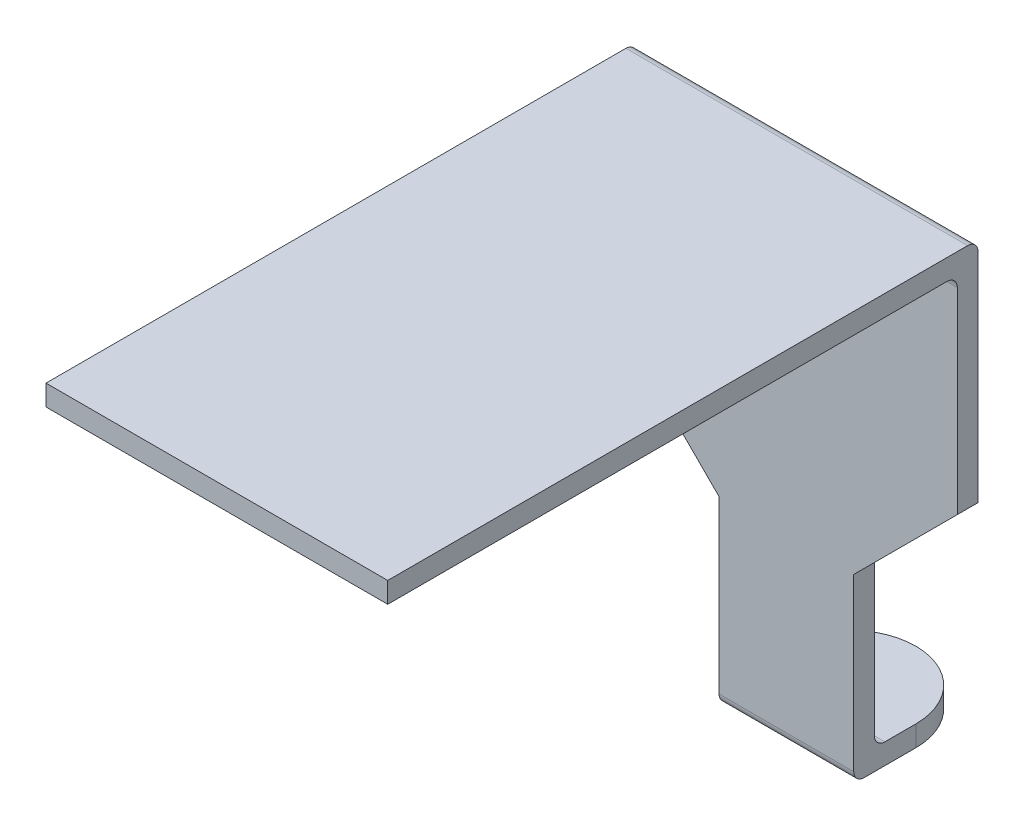
ISO-10303-21;
HEADER;
FILE_DESCRIPTION(('STEP AP214'),'2;1');
FILE_NAME('part.step','',(''),(''),'','','');
FILE_SCHEMA(('AUTOMOTIVE_DESIGN { 1 0 10303 214 1 1 1 1 }'));
ENDSEC;
DATA;
#1=APPLICATION_CONTEXT('core data for automotive mechanical design processes');
#2=APPLICATION_PROTOCOL_DEFINITION('international standard','automotive_design',2000,#1);
#3=PRODUCT_CONTEXT('',#1,'mechanical');
#4=PRODUCT('Part','Part','',(#3));
#5=PRODUCT_RELATED_PRODUCT_CATEGORY('part','',(#4));
#6=PRODUCT_DEFINITION_FORMATION('','',#4);
#7=PRODUCT_DEFINITION_CONTEXT('part definition',#1,'design');
#8=PRODUCT_DEFINITION('design','',#6,#7);
#9=PRODUCT_DEFINITION_SHAPE('','',#8);
#10=(LENGTH_UNIT() NAMED_UNIT(*) SI_UNIT(.MILLI.,.METRE.));
#11=(NAMED_UNIT(*) PLANE_ANGLE_UNIT() SI_UNIT($,.RADIAN.));
#12=(NAMED_UNIT(*) SI_UNIT($,.STERADIAN.) SOLID_ANGLE_UNIT());
#13=UNCERTAINTY_MEASURE_WITH_UNIT(LENGTH_MEASURE(1.E-05),#10,'distance_accuracy_value','');
#14=(GEOMETRIC_REPRESENTATION_CONTEXT(3) GLOBAL_UNCERTAINTY_ASSIGNED_CONTEXT((#13)) GLOBAL_UNIT_ASSIGNED_CONTEXT((#10,
#11,#12)) REPRESENTATION_CONTEXT('',''));
#15=CARTESIAN_POINT('',(0.,0.,0.));
#16=DIRECTION('',(0.,0.,1.));
#17=DIRECTION('',(1.,0.,0.));
#18=AXIS2_PLACEMENT_3D('',#15,#16,#17);
#19=CARTESIAN_POINT('',(5.1,-6.6,-15.));
#20=DIRECTION('',(0.,-1.,0.));
#21=DIRECTION('',(0.,0.,-1.));
#22=AXIS2_PLACEMENT_3D('',#19,#20,#21);
#23=PLANE('',#22);
#24=DIRECTION('',(0.,0.,-1.));
#25=VECTOR('',#24,1.);
#26=CARTESIAN_POINT('',(-0.65,-6.6,-15.));
#27=LINE('',#26,#25);
#28=CARTESIAN_POINT('',(-0.65,-6.6,-13.9));
#29=VERTEX_POINT('',#28);
#30=CARTESIAN_POINT('',(-0.650000000000001,-6.6,-14.4));
#31=VERTEX_POINT('',#30);
#32=EDGE_CURVE('E120',#29,#31,#27,.T.);
#33=ORIENTED_EDGE('',*,*,#32,.T.);
#34=CARTESIAN_POINT('',(0.,-6.6,-14.4));
#35=DIRECTION('',(0.,-1.,0.));
#36=DIRECTION('',(0.,0.,-1.));
#37=AXIS2_PLACEMENT_3D('',#34,#35,#36);
#38=CIRCLE('',#37,0.65);
#39=CARTESIAN_POINT('',(0.649999999999997,-6.6,-14.4));
#40=VERTEX_POINT('',#39);
#41=EDGE_CURVE('E110',#40,#31,#38,.F.);
#42=ORIENTED_EDGE('',*,*,#41,.F.);
#43=DIRECTION('',(0.,0.,-1.));
#44=VECTOR('',#43,1.);
#45=CARTESIAN_POINT('',(0.65,-6.6,-15.));
#46=LINE('',#45,#44);
#47=CARTESIAN_POINT('',(0.65,-6.6,-13.9));
#48=VERTEX_POINT('',#47);
#49=EDGE_CURVE('E125',#40,#48,#46,.F.);
#50=ORIENTED_EDGE('',*,*,#49,.T.);
#51=DIRECTION('',(-1.,0.,0.));
#52=VECTOR('',#51,1.);
#53=CARTESIAN_POINT('',(5.1,-6.6,-13.9));
#54=LINE('',#53,#52);
#55=EDGE_CURVE('E118',#29,#48,#54,.F.);
#56=ORIENTED_EDGE('',*,*,#55,.F.);
#57=EDGE_LOOP('',(#33,#42,#50,#56));
#58=FACE_BOUND('',#57,.T.);
#59=ADVANCED_FACE('F17',(#58),#23,.T.);
#60=CARTESIAN_POINT('',(-0.65,-6.4,-15.05));
#61=DIRECTION('',(0.,-1.,0.));
#62=DIRECTION('',(0.,0.,-1.));
#63=AXIS2_PLACEMENT_3D('',#60,#61,#62);
#64=PLANE('',#63);
#65=DIRECTION('',(1.,0.,0.));
#66=VECTOR('',#65,1.);
#67=CARTESIAN_POINT('',(-0.65,-6.4,-14.1));
#68=LINE('',#67,#66);
#69=CARTESIAN_POINT('',(-0.65,-6.4,-14.1));
#70=VERTEX_POINT('',#69);
#71=CARTESIAN_POINT('',(0.65,-6.4,-14.1));
#72=VERTEX_POINT('',#71);
#73=EDGE_CURVE('E158',#70,#72,#68,.T.);
#74=ORIENTED_EDGE('',*,*,#73,.T.);
#75=DIRECTION('',(0.,0.,-1.));
#76=VECTOR('',#75,1.);
#77=CARTESIAN_POINT('',(0.65,-6.4,-15.05));
#78=LINE('',#77,#76);
#79=CARTESIAN_POINT('',(0.649999999999997,-6.4,-14.4));
#80=VERTEX_POINT('',#79);
#81=EDGE_CURVE('E124',#80,#72,#78,.F.);
#82=ORIENTED_EDGE('',*,*,#81,.F.);
#83=CARTESIAN_POINT('',(0.,-6.4,-14.4));
#84=DIRECTION('',(0.,-1.,0.));
#85=DIRECTION('',(0.,0.,-1.));
#86=AXIS2_PLACEMENT_3D('',#83,#84,#85);
#87=CIRCLE('',#86,0.65);
#88=CARTESIAN_POINT('',(-0.650000000000001,-6.4,-14.4));
#89=VERTEX_POINT('',#88);
#90=EDGE_CURVE('E20',#89,#80,#87,.T.);
#91=ORIENTED_EDGE('',*,*,#90,.F.);
#92=DIRECTION('',(0.,0.,-1.));
#93=VECTOR('',#92,1.);
#94=CARTESIAN_POINT('',(-0.65,-6.4,-14.));
#95=LINE('',#94,#93);
#96=EDGE_CURVE('E129',#89,#70,#95,.F.);
#97=ORIENTED_EDGE('',*,*,#96,.T.);
#98=EDGE_LOOP('',(#74,#82,#91,#97));
#99=FACE_BOUND('',#98,.T.);
#100=ADVANCED_FACE('F175',(#99),#64,.F.);
#101=CARTESIAN_POINT('',(0.,-6.4,-14.4));
#102=DIRECTION('',(0.,-1.,0.));
#103=DIRECTION('',(0.,0.,-1.));
#104=AXIS2_PLACEMENT_3D('',#101,#102,#103);
#105=CYLINDRICAL_SURFACE('',#104,0.65);
#106=DIRECTION('',(0.,1.,0.));
#107=VECTOR('',#106,1.);
#108=CARTESIAN_POINT('',(0.649999999999994,-7.915294643796,-14.4));
#109=LINE('',#108,#107);
#110=EDGE_CURVE('E116',#80,#40,#109,.F.);
#111=ORIENTED_EDGE('',*,*,#110,.T.);
#112=ORIENTED_EDGE('',*,*,#41,.T.);
#113=DIRECTION('',(0.,1.,0.));
#114=VECTOR('',#113,1.);
#115=CARTESIAN_POINT('',(-0.650000000000001,-7.915294643796,-14.4));
#116=LINE('',#115,#114);
#117=EDGE_CURVE('E114',#31,#89,#116,.T.);
#118=ORIENTED_EDGE('',*,*,#117,.T.);
#119=ORIENTED_EDGE('',*,*,#90,.T.);
#120=EDGE_LOOP('',(#111,#112,#118,#119));
#121=FACE_BOUND('',#120,.T.);
#122=ADVANCED_FACE('F112',(#121),#105,.T.);
#123=CARTESIAN_POINT('',(5.1,-6.5,-13.9));
#124=DIRECTION('',(-1.,0.,0.));
#125=DIRECTION('',(0.,0.,1.));
#126=AXIS2_PLACEMENT_3D('',#123,#124,#125);
#127=CYLINDRICAL_SURFACE('',#126,0.1);
#128=CARTESIAN_POINT('',(-0.65,-6.5,-13.9));
#129=DIRECTION('',(-1.,0.,0.));
#130=DIRECTION('',(0.,0.,1.));
#131=AXIS2_PLACEMENT_3D('',#128,#129,#130);
#132=CIRCLE('',#131,0.1);
#133=CARTESIAN_POINT('',(-0.65,-6.5,-13.8));
#134=VERTEX_POINT('',#133);
#135=EDGE_CURVE('E159',#134,#29,#132,.F.);
#136=ORIENTED_EDGE('',*,*,#135,.T.);
#137=ORIENTED_EDGE('',*,*,#55,.T.);
#138=CARTESIAN_POINT('',(0.65,-6.5,-13.9));
#139=DIRECTION('',(-1.,0.,0.));
#140=DIRECTION('',(0.,0.,1.));
#141=AXIS2_PLACEMENT_3D('',#138,#139,#140);
#142=CIRCLE('',#141,0.1);
#143=CARTESIAN_POINT('',(0.65,-6.5,-13.8));
#144=VERTEX_POINT('',#143);
#145=EDGE_CURVE('E142',#48,#144,#142,.T.);
#146=ORIENTED_EDGE('',*,*,#145,.T.);
#147=DIRECTION('',(-1.,0.,0.));
#148=VECTOR('',#147,1.);
#149=CARTESIAN_POINT('',(1.65,-6.5,-13.8));
#150=LINE('',#149,#148);
#151=EDGE_CURVE('E229',#144,#134,#150,.T.);
#152=ORIENTED_EDGE('',*,*,#151,.T.);
#153=EDGE_LOOP('',(#136,#137,#146,#152));
#154=FACE_BOUND('',#153,.T.);
#155=ADVANCED_FACE('F467',(#154),#127,.T.);
#156=CARTESIAN_POINT('',(1.65,-1.95,-13.7));
#157=DIRECTION('',(-1.,0.,0.));
#158=DIRECTION('',(0.,0.,1.));
#159=AXIS2_PLACEMENT_3D('',#156,#157,#158);
#160=CYLINDRICAL_SURFACE('',#159,0.1);
#161=DIRECTION('',(1.,0.,0.));
#162=VECTOR('',#161,1.);
#163=CARTESIAN_POINT('',(-1.65,-1.85,-13.7));
#164=LINE('',#163,#162);
#165=CARTESIAN_POINT('',(1.65,-1.85,-13.7));
#166=VERTEX_POINT('',#165);
#167=CARTESIAN_POINT('',(-1.65,-1.85,-13.7));
#168=VERTEX_POINT('',#167);
#169=EDGE_CURVE('E256',#166,#168,#164,.F.);
#170=ORIENTED_EDGE('',*,*,#169,.T.);
#171=CARTESIAN_POINT('',(-1.65,-1.95,-13.7));
#172=DIRECTION('',(-1.,0.,0.));
#173=DIRECTION('',(0.,0.,1.));
#174=AXIS2_PLACEMENT_3D('',#171,#172,#173);
#175=CIRCLE('',#174,0.1);
#176=CARTESIAN_POINT('',(-1.65,-1.95,-13.8));
#177=VERTEX_POINT('',#176);
#178=EDGE_CURVE('E163',#177,#168,#175,.F.);
#179=ORIENTED_EDGE('',*,*,#178,.F.);
#180=DIRECTION('',(-1.,0.,0.));
#181=VECTOR('',#180,1.);
#182=CARTESIAN_POINT('',(1.65,-1.95,-13.8));
#183=LINE('',#182,#181);
#184=CARTESIAN_POINT('',(1.64999999999999,-1.95,-13.8));
#185=VERTEX_POINT('',#184);
#186=EDGE_CURVE('E242',#177,#185,#183,.F.);
#187=ORIENTED_EDGE('',*,*,#186,.T.);
#188=CARTESIAN_POINT('',(1.65,-1.95,-13.7));
#189=DIRECTION('',(-1.,0.,0.));
#190=DIRECTION('',(0.,0.,1.));
#191=AXIS2_PLACEMENT_3D('',#188,#189,#190);
#192=CIRCLE('',#191,0.1);
#193=EDGE_CURVE('E161',#166,#185,#192,.T.);
#194=ORIENTED_EDGE('',*,*,#193,.F.);
#195=EDGE_LOOP('',(#170,#179,#187,#194));
#196=FACE_BOUND('',#195,.T.);
#197=ADVANCED_FACE('F349',(#196),#160,.F.);
#198=CARTESIAN_POINT('',(0.65,-4.85,-14.));
#199=DIRECTION('',(0.707106781186048,-0.707106781187048,0.));
#200=DIRECTION('',(0.707106781187048,0.707106781186048,0.));
#201=AXIS2_PLACEMENT_3D('',#198,#199,#200);
#202=PLANE('',#201);
#203=DIRECTION('',(-0.707106781186901,-0.707106781186194,0.));
#204=VECTOR('',#203,1.);
#205=CARTESIAN_POINT('',(1.65,-3.850000000001,-13.8));
#206=LINE('',#205,#204);
#207=CARTESIAN_POINT('',(1.64999999999989,-3.85000000000113,-13.8));
#208=VERTEX_POINT('',#207);
#209=CARTESIAN_POINT('',(0.65,-4.85,-13.8));
#210=VERTEX_POINT('',#209);
#211=EDGE_CURVE('E152',#208,#210,#206,.T.);
#212=ORIENTED_EDGE('',*,*,#211,.T.);
#213=DIRECTION('',(0.,0.,1.));
#214=VECTOR('',#213,1.);
#215=CARTESIAN_POINT('',(0.65,-4.85,-13.8));
#216=LINE('',#215,#214);
#217=CARTESIAN_POINT('',(0.65,-4.85,-14.));
#218=VERTEX_POINT('',#217);
#219=EDGE_CURVE('E155',#210,#218,#216,.F.);
#220=ORIENTED_EDGE('',*,*,#219,.T.);
#221=DIRECTION('',(0.707106781186901,0.707106781186194,0.));
#222=VECTOR('',#221,1.);
#223=CARTESIAN_POINT('',(0.65,-4.85,-14.));
#224=LINE('',#223,#222);
#225=CARTESIAN_POINT('',(1.64999999999989,-3.85000000000113,-14.));
#226=VERTEX_POINT('',#225);
#227=EDGE_CURVE('E195',#218,#226,#224,.T.);
#228=ORIENTED_EDGE('',*,*,#227,.T.);
#229=DIRECTION('',(0.,0.,1.));
#230=VECTOR('',#229,1.);
#231=CARTESIAN_POINT('',(1.65000000000021,-3.85000000000121,-14.));
#232=LINE('',#231,#230);
#233=EDGE_CURVE('E135',#226,#208,#232,.T.);
#234=ORIENTED_EDGE('',*,*,#233,.T.);
#235=EDGE_LOOP('',(#212,#220,#228,#234));
#236=FACE_BOUND('',#235,.T.);
#237=ADVANCED_FACE('F344',(#236),#202,.T.);
#238=CARTESIAN_POINT('',(-0.65,-4.85,-14.));
#239=DIRECTION('',(-0.707106781186548,-0.707106781186548,0.));
#240=DIRECTION('',(0.707106781186548,-0.707106781186548,0.));
#241=AXIS2_PLACEMENT_3D('',#238,#239,#240);
#242=PLANE('',#241);
#243=DIRECTION('',(0.707106781186548,-0.707106781186548,0.));
#244=VECTOR('',#243,1.);
#245=CARTESIAN_POINT('',(-1.65,-3.85,-14.));
#246=LINE('',#245,#244);
#247=CARTESIAN_POINT('',(-1.65,-3.85,-14.));
#248=VERTEX_POINT('',#247);
#249=CARTESIAN_POINT('',(-0.65,-4.85,-14.));
#250=VERTEX_POINT('',#249);
#251=EDGE_CURVE('E212',#248,#250,#246,.T.);
#252=ORIENTED_EDGE('',*,*,#251,.T.);
#253=DIRECTION('',(0.,0.,-1.));
#254=VECTOR('',#253,1.);
#255=CARTESIAN_POINT('',(-0.65,-4.85,-14.));
#256=LINE('',#255,#254);
#257=CARTESIAN_POINT('',(-0.65,-4.85,-13.8));
#258=VERTEX_POINT('',#257);
#259=EDGE_CURVE('E132',#250,#258,#256,.F.);
#260=ORIENTED_EDGE('',*,*,#259,.T.);
#261=DIRECTION('',(-0.707106781186548,0.707106781186548,0.));
#262=VECTOR('',#261,1.);
#263=CARTESIAN_POINT('',(-0.65,-4.85,-13.8));
#264=LINE('',#263,#262);
#265=CARTESIAN_POINT('',(-1.65,-3.85,-13.8));
#266=VERTEX_POINT('',#265);
#267=EDGE_CURVE('E228',#258,#266,#264,.T.);
#268=ORIENTED_EDGE('',*,*,#267,.T.);
#269=DIRECTION('',(0.,0.,1.));
#270=VECTOR('',#269,1.);
#271=CARTESIAN_POINT('',(-1.65,-3.85,-14.));
#272=LINE('',#271,#270);
#273=EDGE_CURVE('E130',#266,#248,#272,.F.);
#274=ORIENTED_EDGE('',*,*,#273,.T.);
#275=EDGE_LOOP('',(#252,#260,#268,#274));
#276=FACE_BOUND('',#275,.T.);
#277=ADVANCED_FACE('F445',(#276),#242,.T.);
#278=CARTESIAN_POINT('',(-0.65,-7.915294643796,-14.));
#279=DIRECTION('',(1.,0.,0.));
#280=DIRECTION('',(0.,0.,-1.));
#281=AXIS2_PLACEMENT_3D('',#278,#279,#280);
#282=PLANE('',#281);
#283=ORIENTED_EDGE('',*,*,#135,.F.);
#284=DIRECTION('',(0.,1.,0.));
#285=VECTOR('',#284,1.);
#286=CARTESIAN_POINT('',(-0.65,-4.85,-13.8));
#287=LINE('',#286,#285);
#288=EDGE_CURVE('E225',#134,#258,#287,.T.);
#289=ORIENTED_EDGE('',*,*,#288,.T.);
#290=ORIENTED_EDGE('',*,*,#259,.F.);
#291=DIRECTION('',(0.,1.,0.));
#292=VECTOR('',#291,1.);
#293=CARTESIAN_POINT('',(-0.65,-1.65,-14.));
#294=LINE('',#293,#292);
#295=CARTESIAN_POINT('',(-0.65,-6.3,-14.));
#296=VERTEX_POINT('',#295);
#297=EDGE_CURVE('E202',#250,#296,#294,.F.);
#298=ORIENTED_EDGE('',*,*,#297,.T.);
#299=CARTESIAN_POINT('',(-0.65,-6.3,-14.1));
#300=DIRECTION('',(1.,0.,0.));
#301=DIRECTION('',(0.,0.,-1.));
#302=AXIS2_PLACEMENT_3D('',#299,#300,#301);
#303=CIRCLE('',#302,0.1);
#304=EDGE_CURVE('E156',#296,#70,#303,.T.);
#305=ORIENTED_EDGE('',*,*,#304,.T.);
#306=ORIENTED_EDGE('',*,*,#96,.F.);
#307=ORIENTED_EDGE('',*,*,#117,.F.);
#308=ORIENTED_EDGE('',*,*,#32,.F.);
#309=EDGE_LOOP('',(#283,#289,#290,#298,#305,#306,#307,#308));
#310=FACE_BOUND('',#309,.T.);
#311=ADVANCED_FACE('F127',(#310),#282,.F.);
#312=CARTESIAN_POINT('',(-0.65,-6.3,-14.1));
#313=DIRECTION('',(1.,0.,0.));
#314=DIRECTION('',(0.,0.,-1.));
#315=AXIS2_PLACEMENT_3D('',#312,#313,#314);
#316=CYLINDRICAL_SURFACE('',#315,0.1);
#317=DIRECTION('',(1.,0.,0.));
#318=VECTOR('',#317,1.);
#319=CARTESIAN_POINT('',(-1.65,-6.3,-14.));
#320=LINE('',#319,#318);
#321=CARTESIAN_POINT('',(0.65,-6.3,-14.));
#322=VERTEX_POINT('',#321);
#323=EDGE_CURVE('E180',#296,#322,#320,.T.);
#324=ORIENTED_EDGE('',*,*,#323,.T.);
#325=CARTESIAN_POINT('',(0.65,-6.3,-14.1));
#326=DIRECTION('',(1.,0.,0.));
#327=DIRECTION('',(0.,0.,-1.));
#328=AXIS2_PLACEMENT_3D('',#325,#326,#327);
#329=CIRCLE('',#328,0.1);
#330=EDGE_CURVE('E143',#322,#72,#329,.T.);
#331=ORIENTED_EDGE('',*,*,#330,.T.);
#332=ORIENTED_EDGE('',*,*,#73,.F.);
#333=ORIENTED_EDGE('',*,*,#304,.F.);
#334=EDGE_LOOP('',(#324,#331,#332,#333));
#335=FACE_BOUND('',#334,.T.);
#336=ADVANCED_FACE('F178',(#335),#316,.F.);
#337=CARTESIAN_POINT('',(0.65,-7.915294643796,-13.8));
#338=DIRECTION('',(-1.,0.,0.));
#339=DIRECTION('',(0.,0.,1.));
#340=AXIS2_PLACEMENT_3D('',#337,#338,#339);
#341=PLANE('',#340);
#342=ORIENTED_EDGE('',*,*,#145,.F.);
#343=ORIENTED_EDGE('',*,*,#49,.F.);
#344=ORIENTED_EDGE('',*,*,#110,.F.);
#345=ORIENTED_EDGE('',*,*,#81,.T.);
#346=ORIENTED_EDGE('',*,*,#330,.F.);
#347=DIRECTION('',(0.,1.,0.));
#348=VECTOR('',#347,1.);
#349=CARTESIAN_POINT('',(0.65,-1.65,-14.));
#350=LINE('',#349,#348);
#351=EDGE_CURVE('E187',#322,#218,#350,.T.);
#352=ORIENTED_EDGE('',*,*,#351,.T.);
#353=ORIENTED_EDGE('',*,*,#219,.F.);
#354=DIRECTION('',(0.,1.,0.));
#355=VECTOR('',#354,1.);
#356=CARTESIAN_POINT('',(0.65,-4.85,-13.8));
#357=LINE('',#356,#355);
#358=EDGE_CURVE('E233',#210,#144,#357,.F.);
#359=ORIENTED_EDGE('',*,*,#358,.T.);
#360=EDGE_LOOP('',(#342,#343,#344,#345,#346,#352,#353,#359));
#361=FACE_BOUND('',#360,.T.);
#362=ADVANCED_FACE('F184',(#361),#341,.F.);
#363=CARTESIAN_POINT('',(1.65,-4.85,-13.8));
#364=DIRECTION('',(0.,0.,-1.));
#365=DIRECTION('',(-1.,0.,0.));
#366=AXIS2_PLACEMENT_3D('',#363,#364,#365);
#367=PLANE('',#366);
#368=ORIENTED_EDGE('',*,*,#186,.F.);
#369=DIRECTION('',(0.,1.,0.));
#370=VECTOR('',#369,1.);
#371=CARTESIAN_POINT('',(-1.65,-1.65,-13.8));
#372=LINE('',#371,#370);
#373=EDGE_CURVE('E279',#177,#266,#372,.F.);
#374=ORIENTED_EDGE('',*,*,#373,.T.);
#375=ORIENTED_EDGE('',*,*,#267,.F.);
#376=ORIENTED_EDGE('',*,*,#288,.F.);
#377=ORIENTED_EDGE('',*,*,#151,.F.);
#378=ORIENTED_EDGE('',*,*,#358,.F.);
#379=ORIENTED_EDGE('',*,*,#211,.F.);
#380=DIRECTION('',(-1.767249541151E-13,-1.,0.));
#381=VECTOR('',#380,1.);
#382=CARTESIAN_POINT('',(1.65,-1.85,-13.8));
#383=LINE('',#382,#381);
#384=EDGE_CURVE('E268',#208,#185,#383,.F.);
#385=ORIENTED_EDGE('',*,*,#384,.T.);
#386=EDGE_LOOP('',(#368,#374,#375,#376,#377,#378,#379,#385));
#387=FACE_BOUND('',#386,.T.);
#388=ADVANCED_FACE('F346',(#387),#367,.F.);
#389=CARTESIAN_POINT('',(-1.65,-1.85,-14.));
#390=DIRECTION('',(0.,1.,0.));
#391=DIRECTION('',(0.,0.,1.));
#392=AXIS2_PLACEMENT_3D('',#389,#390,#391);
#393=PLANE('',#392);
#394=ORIENTED_EDGE('',*,*,#169,.F.);
#395=DIRECTION('',(0.,0.,1.));
#396=VECTOR('',#395,1.);
#397=CARTESIAN_POINT('',(1.65,-1.85,-14.));
#398=LINE('',#397,#396);
#399=CARTESIAN_POINT('',(1.65,-1.85,-8.3));
#400=VERTEX_POINT('',#399);
#401=EDGE_CURVE('E300',#166,#400,#398,.T.);
#402=ORIENTED_EDGE('',*,*,#401,.T.);
#403=DIRECTION('',(1.,0.,0.));
#404=VECTOR('',#403,1.);
#405=CARTESIAN_POINT('',(-1.65,-1.85,-8.3));
#406=LINE('',#405,#404);
#407=CARTESIAN_POINT('',(-1.65,-1.85,-8.3));
#408=VERTEX_POINT('',#407);
#409=EDGE_CURVE('E197',#408,#400,#406,.T.);
#410=ORIENTED_EDGE('',*,*,#409,.F.);
#411=DIRECTION('',(0.,0.,-1.));
#412=VECTOR('',#411,1.);
#413=CARTESIAN_POINT('',(-1.65,-1.85,-14.));
#414=LINE('',#413,#412);
#415=EDGE_CURVE('E275',#408,#168,#414,.T.);
#416=ORIENTED_EDGE('',*,*,#415,.T.);
#417=EDGE_LOOP('',(#394,#402,#410,#416));
#418=FACE_BOUND('',#417,.T.);
#419=ADVANCED_FACE('F350',(#418),#393,.F.);
#420=CARTESIAN_POINT('',(-1.65,-1.65,-14.));
#421=DIRECTION('',(0.,0.,1.));
#422=DIRECTION('',(1.,0.,0.));
#423=AXIS2_PLACEMENT_3D('',#420,#421,#422);
#424=PLANE('',#423);
#425=ORIENTED_EDGE('',*,*,#323,.F.);
#426=ORIENTED_EDGE('',*,*,#297,.F.);
#427=ORIENTED_EDGE('',*,*,#251,.F.);
#428=DIRECTION('',(0.,1.,0.));
#429=VECTOR('',#428,1.);
#430=CARTESIAN_POINT('',(-1.65,-1.65,-14.));
#431=LINE('',#430,#429);
#432=CARTESIAN_POINT('',(-1.65,-1.75,-14.));
#433=VERTEX_POINT('',#432);
#434=EDGE_CURVE('E150',#248,#433,#431,.T.);
#435=ORIENTED_EDGE('',*,*,#434,.T.);
#436=DIRECTION('',(-1.,0.,0.));
#437=VECTOR('',#436,1.);
#438=CARTESIAN_POINT('',(-1.65,-1.75,-14.));
#439=LINE('',#438,#437);
#440=CARTESIAN_POINT('',(1.65000000000001,-1.75,-14.));
#441=VERTEX_POINT('',#440);
#442=EDGE_CURVE('E149',#441,#433,#439,.T.);
#443=ORIENTED_EDGE('',*,*,#442,.F.);
#444=DIRECTION('',(-1.767249541151E-13,-1.,0.));
#445=VECTOR('',#444,1.);
#446=CARTESIAN_POINT('',(1.65,-1.85,-14.));
#447=LINE('',#446,#445);
#448=EDGE_CURVE('E145',#441,#226,#447,.T.);
#449=ORIENTED_EDGE('',*,*,#448,.T.);
#450=ORIENTED_EDGE('',*,*,#227,.F.);
#451=ORIENTED_EDGE('',*,*,#351,.F.);
#452=EDGE_LOOP('',(#425,#426,#427,#435,#443,#449,#450,#451));
#453=FACE_BOUND('',#452,.T.);
#454=ADVANCED_FACE('F190',(#453),#424,.F.);
#455=CARTESIAN_POINT('',(-1.65,-1.65,-8.3));
#456=DIRECTION('',(0.,0.,1.));
#457=DIRECTION('',(1.,0.,0.));
#458=AXIS2_PLACEMENT_3D('',#455,#456,#457);
#459=PLANE('',#458);
#460=ORIENTED_EDGE('',*,*,#409,.T.);
#461=DIRECTION('',(-1.767249541151E-13,-1.,0.));
#462=VECTOR('',#461,1.);
#463=CARTESIAN_POINT('',(1.65,-1.85,-8.3));
#464=LINE('',#463,#462);
#465=CARTESIAN_POINT('',(1.65000000000001,-1.65,-8.3));
#466=VERTEX_POINT('',#465);
#467=EDGE_CURVE('E146',#400,#466,#464,.F.);
#468=ORIENTED_EDGE('',*,*,#467,.T.);
#469=DIRECTION('',(1.,0.,0.));
#470=VECTOR('',#469,1.);
#471=CARTESIAN_POINT('',(1.65,-1.65,-8.3));
#472=LINE('',#471,#470);
#473=CARTESIAN_POINT('',(-1.65,-1.65,-8.3));
#474=VERTEX_POINT('',#473);
#475=EDGE_CURVE('E291',#466,#474,#472,.F.);
#476=ORIENTED_EDGE('',*,*,#475,.T.);
#477=DIRECTION('',(0.,1.,0.));
#478=VECTOR('',#477,1.);
#479=CARTESIAN_POINT('',(-1.65,-1.65,-8.3));
#480=LINE('',#479,#478);
#481=EDGE_CURVE('E200',#474,#408,#480,.F.);
#482=ORIENTED_EDGE('',*,*,#481,.T.);
#483=EDGE_LOOP('',(#460,#468,#476,#482));
#484=FACE_BOUND('',#483,.T.);
#485=ADVANCED_FACE('F330',(#484),#459,.T.);
#486=CARTESIAN_POINT('',(-1.65,-1.65,-14.));
#487=DIRECTION('',(1.,0.,0.));
#488=DIRECTION('',(0.,0.,-1.));
#489=AXIS2_PLACEMENT_3D('',#486,#487,#488);
#490=PLANE('',#489);
#491=CARTESIAN_POINT('',(-1.65,-1.75,-13.9));
#492=DIRECTION('',(-1.,0.,0.));
#493=DIRECTION('',(0.,0.,1.));
#494=AXIS2_PLACEMENT_3D('',#491,#492,#493);
#495=CIRCLE('',#494,0.1);
#496=CARTESIAN_POINT('',(-1.65,-1.65,-13.9));
#497=VERTEX_POINT('',#496);
#498=EDGE_CURVE('E147',#433,#497,#495,.F.);
#499=ORIENTED_EDGE('',*,*,#498,.F.);
#500=ORIENTED_EDGE('',*,*,#434,.F.);
#501=ORIENTED_EDGE('',*,*,#273,.F.);
#502=ORIENTED_EDGE('',*,*,#373,.F.);
#503=ORIENTED_EDGE('',*,*,#178,.T.);
#504=ORIENTED_EDGE('',*,*,#415,.F.);
#505=ORIENTED_EDGE('',*,*,#481,.F.);
#506=DIRECTION('',(0.,0.,-1.));
#507=VECTOR('',#506,1.);
#508=CARTESIAN_POINT('',(-1.65,-1.65,-14.));
#509=LINE('',#508,#507);
#510=EDGE_CURVE('E288',#474,#497,#509,.T.);
#511=ORIENTED_EDGE('',*,*,#510,.T.);
#512=EDGE_LOOP('',(#499,#500,#501,#502,#503,#504,#505,#511));
#513=FACE_BOUND('',#512,.T.);
#514=ADVANCED_FACE('F326',(#513),#490,.F.);
#515=CARTESIAN_POINT('',(-1.65,-1.75,-13.9));
#516=DIRECTION('',(-1.,0.,0.));
#517=DIRECTION('',(0.,0.,1.));
#518=AXIS2_PLACEMENT_3D('',#515,#516,#517);
#519=CYLINDRICAL_SURFACE('',#518,0.1);
#520=CARTESIAN_POINT('',(1.65,-1.75,-13.9));
#521=DIRECTION('',(-1.,0.,0.));
#522=DIRECTION('',(0.,0.,1.));
#523=AXIS2_PLACEMENT_3D('',#520,#521,#522);
#524=CIRCLE('',#523,0.1);
#525=CARTESIAN_POINT('',(1.65,-1.65,-13.9));
#526=VERTEX_POINT('',#525);
#527=EDGE_CURVE('E34',#526,#441,#524,.T.);
#528=ORIENTED_EDGE('',*,*,#527,.T.);
#529=ORIENTED_EDGE('',*,*,#442,.T.);
#530=ORIENTED_EDGE('',*,*,#498,.T.);
#531=DIRECTION('',(1.,0.,0.));
#532=VECTOR('',#531,1.);
#533=CARTESIAN_POINT('',(1.65,-1.65,-13.9));
#534=LINE('',#533,#532);
#535=EDGE_CURVE('E26',#497,#526,#534,.T.);
#536=ORIENTED_EDGE('',*,*,#535,.T.);
#537=EDGE_LOOP('',(#528,#529,#530,#536));
#538=FACE_BOUND('',#537,.T.);
#539=ADVANCED_FACE('F318',(#538),#519,.T.);
#540=CARTESIAN_POINT('',(1.65,-1.85,-14.));
#541=DIRECTION('',(-1.,1.767249541151E-13,0.));
#542=DIRECTION('',(-1.767249541151E-13,-1.,0.));
#543=AXIS2_PLACEMENT_3D('',#540,#541,#542);
#544=PLANE('',#543);
#545=ORIENTED_EDGE('',*,*,#527,.F.);
#546=DIRECTION('',(0.,0.,-1.));
#547=VECTOR('',#546,1.);
#548=CARTESIAN_POINT('',(1.65,-1.65,-14.));
#549=LINE('',#548,#547);
#550=EDGE_CURVE('E11',#526,#466,#549,.F.);
#551=ORIENTED_EDGE('',*,*,#550,.T.);
#552=ORIENTED_EDGE('',*,*,#467,.F.);
#553=ORIENTED_EDGE('',*,*,#401,.F.);
#554=ORIENTED_EDGE('',*,*,#193,.T.);
#555=ORIENTED_EDGE('',*,*,#384,.F.);
#556=ORIENTED_EDGE('',*,*,#233,.F.);
#557=ORIENTED_EDGE('',*,*,#448,.F.);
#558=EDGE_LOOP('',(#545,#551,#552,#553,#554,#555,#556,#557));
#559=FACE_BOUND('',#558,.T.);
#560=ADVANCED_FACE('F315',(#559),#544,.F.);
#561=CARTESIAN_POINT('',(1.65,-1.65,-14.));
#562=DIRECTION('',(0.,-1.,0.));
#563=DIRECTION('',(0.,0.,-1.));
#564=AXIS2_PLACEMENT_3D('',#561,#562,#563);
#565=PLANE('',#564);
#566=ORIENTED_EDGE('',*,*,#535,.F.);
#567=ORIENTED_EDGE('',*,*,#510,.F.);
#568=ORIENTED_EDGE('',*,*,#475,.F.);
#569=ORIENTED_EDGE('',*,*,#550,.F.);
#570=EDGE_LOOP('',(#566,#567,#568,#569));
#571=FACE_BOUND('',#570,.T.);
#572=ADVANCED_FACE('F323',(#571),#565,.F.);
#573=CLOSED_SHELL('',(#59,#100,#122,#155,#197,#237,#277,#311,#336,#362,#388,#419,#454,#485,#514,
#539,#560,#572));
#574=MANIFOLD_SOLID_BREP('B1',#573);
#575=ADVANCED_BREP_SHAPE_REPRESENTATION('',(#18,#574),#14);
#576=SHAPE_DEFINITION_REPRESENTATION(#9,#575);
ENDSEC;
END-ISO-10303-21;
